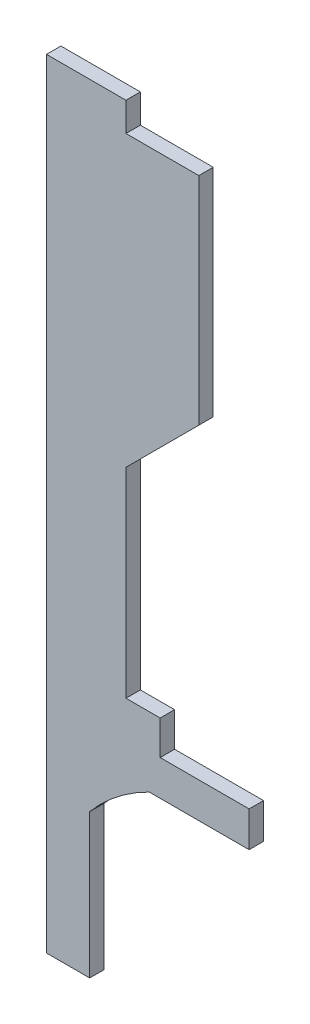
ISO-10303-21;
HEADER;
FILE_DESCRIPTION(('STEP AP214'),'2;1');
FILE_NAME('part.step','',(''),(''),'','','');
FILE_SCHEMA(('AUTOMOTIVE_DESIGN { 1 0 10303 214 1 1 1 1 }'));
ENDSEC;
DATA;
#1=APPLICATION_CONTEXT('core data for automotive mechanical design processes');
#2=APPLICATION_PROTOCOL_DEFINITION('international standard','automotive_design',2000,#1);
#3=PRODUCT_CONTEXT('',#1,'mechanical');
#4=PRODUCT('Part','Part','',(#3));
#5=PRODUCT_RELATED_PRODUCT_CATEGORY('part','',(#4));
#6=PRODUCT_DEFINITION_FORMATION('','',#4);
#7=PRODUCT_DEFINITION_CONTEXT('part definition',#1,'design');
#8=PRODUCT_DEFINITION('design','',#6,#7);
#9=PRODUCT_DEFINITION_SHAPE('','',#8);
#10=(LENGTH_UNIT() NAMED_UNIT(*) SI_UNIT(.MILLI.,.METRE.));
#11=(NAMED_UNIT(*) PLANE_ANGLE_UNIT() SI_UNIT($,.RADIAN.));
#12=(NAMED_UNIT(*) SI_UNIT($,.STERADIAN.) SOLID_ANGLE_UNIT());
#13=UNCERTAINTY_MEASURE_WITH_UNIT(LENGTH_MEASURE(1.E-05),#10,'distance_accuracy_value','');
#14=(GEOMETRIC_REPRESENTATION_CONTEXT(3) GLOBAL_UNCERTAINTY_ASSIGNED_CONTEXT((#13)) GLOBAL_UNIT_ASSIGNED_CONTEXT((#10,
#11,#12)) REPRESENTATION_CONTEXT('',''));
#15=CARTESIAN_POINT('',(0.,0.,0.));
#16=DIRECTION('',(0.,0.,1.));
#17=DIRECTION('',(1.,0.,0.));
#18=AXIS2_PLACEMENT_3D('',#15,#16,#17);
#19=CARTESIAN_POINT('',(27.5725376562433,260.,5.));
#20=DIRECTION('',(0.,-1.,0.));
#21=DIRECTION('',(0.,0.,-1.));
#22=AXIS2_PLACEMENT_3D('',#19,#20,#21);
#23=PLANE('',#22);
#24=DIRECTION('',(-1.,0.,0.));
#25=VECTOR('',#24,1.);
#26=CARTESIAN_POINT('',(27.5725376562433,260.,0.));
#27=LINE('',#26,#25);
#28=CARTESIAN_POINT('',(52.8550366334516,260.,0.));
#29=VERTEX_POINT('',#28);
#30=CARTESIAN_POINT('',(27.5725376562433,260.,0.));
#31=VERTEX_POINT('',#30);
#32=EDGE_CURVE('E171',#29,#31,#27,.T.);
#33=ORIENTED_EDGE('',*,*,#32,.T.);
#34=DIRECTION('',(0.,0.,-1.));
#35=VECTOR('',#34,1.);
#36=CARTESIAN_POINT('',(27.5725376562433,260.,5.));
#37=LINE('',#36,#35);
#38=CARTESIAN_POINT('',(27.5725376562433,260.,5.));
#39=VERTEX_POINT('',#38);
#40=EDGE_CURVE('E11',#39,#31,#37,.T.);
#41=ORIENTED_EDGE('',*,*,#40,.F.);
#42=DIRECTION('',(-1.,0.,0.));
#43=VECTOR('',#42,1.);
#44=CARTESIAN_POINT('',(27.5725376562433,260.,5.));
#45=LINE('',#44,#43);
#46=CARTESIAN_POINT('',(52.8550366334516,260.,5.));
#47=VERTEX_POINT('',#46);
#48=EDGE_CURVE('E199',#47,#39,#45,.T.);
#49=ORIENTED_EDGE('',*,*,#48,.F.);
#50=DIRECTION('',(0.,0.,-1.));
#51=VECTOR('',#50,1.);
#52=CARTESIAN_POINT('',(52.8550366334516,260.,5.));
#53=LINE('',#52,#51);
#54=EDGE_CURVE('E167',#47,#29,#53,.T.);
#55=ORIENTED_EDGE('',*,*,#54,.T.);
#56=EDGE_LOOP('',(#33,#41,#49,#55));
#57=FACE_BOUND('',#56,.T.);
#58=ADVANCED_FACE('F33',(#57),#23,.F.);
#59=CARTESIAN_POINT('',(27.5725376562433,270.,5.));
#60=DIRECTION('',(-1.,0.,0.));
#61=DIRECTION('',(0.,0.,1.));
#62=AXIS2_PLACEMENT_3D('',#59,#60,#61);
#63=PLANE('',#62);
#64=DIRECTION('',(0.,1.,0.));
#65=VECTOR('',#64,1.);
#66=CARTESIAN_POINT('',(27.5725376562433,270.,0.));
#67=LINE('',#66,#65);
#68=CARTESIAN_POINT('',(27.5725376562433,270.,0.));
#69=VERTEX_POINT('',#68);
#70=EDGE_CURVE('E174',#31,#69,#67,.T.);
#71=ORIENTED_EDGE('',*,*,#70,.T.);
#72=DIRECTION('',(0.,0.,-1.));
#73=VECTOR('',#72,1.);
#74=CARTESIAN_POINT('',(27.5725376562433,270.,5.));
#75=LINE('',#74,#73);
#76=CARTESIAN_POINT('',(27.5725376562433,270.,5.));
#77=VERTEX_POINT('',#76);
#78=EDGE_CURVE('E41',#77,#69,#75,.T.);
#79=ORIENTED_EDGE('',*,*,#78,.F.);
#80=DIRECTION('',(0.,1.,0.));
#81=VECTOR('',#80,1.);
#82=CARTESIAN_POINT('',(27.5725376562433,270.,5.));
#83=LINE('',#82,#81);
#84=EDGE_CURVE('E113',#39,#77,#83,.T.);
#85=ORIENTED_EDGE('',*,*,#84,.F.);
#86=ORIENTED_EDGE('',*,*,#40,.T.);
#87=EDGE_LOOP('',(#71,#79,#85,#86));
#88=FACE_BOUND('',#87,.T.);
#89=ADVANCED_FACE('F292',(#88),#63,.F.);
#90=CARTESIAN_POINT('',(0.,270.,5.));
#91=DIRECTION('',(0.,-1.,0.));
#92=DIRECTION('',(0.,0.,-1.));
#93=AXIS2_PLACEMENT_3D('',#90,#91,#92);
#94=PLANE('',#93);
#95=DIRECTION('',(-1.,0.,0.));
#96=VECTOR('',#95,1.);
#97=CARTESIAN_POINT('',(0.,270.,0.));
#98=LINE('',#97,#96);
#99=CARTESIAN_POINT('',(0.,270.,0.));
#100=VERTEX_POINT('',#99);
#101=EDGE_CURVE('E176',#69,#100,#98,.T.);
#102=ORIENTED_EDGE('',*,*,#101,.T.);
#103=DIRECTION('',(0.,0.,-1.));
#104=VECTOR('',#103,1.);
#105=CARTESIAN_POINT('',(0.,270.,5.));
#106=LINE('',#105,#104);
#107=CARTESIAN_POINT('',(0.,270.,5.));
#108=VERTEX_POINT('',#107);
#109=EDGE_CURVE('E227',#108,#100,#106,.T.);
#110=ORIENTED_EDGE('',*,*,#109,.F.);
#111=DIRECTION('',(-1.,0.,0.));
#112=VECTOR('',#111,1.);
#113=CARTESIAN_POINT('',(0.,270.,5.));
#114=LINE('',#113,#112);
#115=EDGE_CURVE('E235',#77,#108,#114,.T.);
#116=ORIENTED_EDGE('',*,*,#115,.F.);
#117=ORIENTED_EDGE('',*,*,#78,.T.);
#118=EDGE_LOOP('',(#102,#110,#116,#117));
#119=FACE_BOUND('',#118,.T.);
#120=ADVANCED_FACE('F233',(#119),#94,.F.);
#121=CARTESIAN_POINT('',(0.,270.,5.));
#122=DIRECTION('',(1.,0.,0.));
#123=DIRECTION('',(0.,1.,0.));
#124=AXIS2_PLACEMENT_3D('',#121,#122,#123);
#125=PLANE('',#124);
#126=DIRECTION('',(0.,-1.,0.));
#127=VECTOR('',#126,1.);
#128=CARTESIAN_POINT('',(0.,270.,0.));
#129=LINE('',#128,#127);
#130=CARTESIAN_POINT('',(0.,0.,0.));
#131=VERTEX_POINT('',#130);
#132=EDGE_CURVE('E178',#100,#131,#129,.T.);
#133=ORIENTED_EDGE('',*,*,#132,.T.);
#134=DIRECTION('',(0.,0.,-1.));
#135=VECTOR('',#134,1.);
#136=CARTESIAN_POINT('',(0.,0.,5.));
#137=LINE('',#136,#135);
#138=CARTESIAN_POINT('',(0.,0.,5.));
#139=VERTEX_POINT('',#138);
#140=EDGE_CURVE('E224',#139,#131,#137,.T.);
#141=ORIENTED_EDGE('',*,*,#140,.F.);
#142=DIRECTION('',(0.,-1.,0.));
#143=VECTOR('',#142,1.);
#144=CARTESIAN_POINT('',(0.,270.,5.));
#145=LINE('',#144,#143);
#146=EDGE_CURVE('E253',#108,#139,#145,.T.);
#147=ORIENTED_EDGE('',*,*,#146,.F.);
#148=ORIENTED_EDGE('',*,*,#109,.T.);
#149=EDGE_LOOP('',(#133,#141,#147,#148));
#150=FACE_BOUND('',#149,.T.);
#151=ADVANCED_FACE('F244',(#150),#125,.F.);
#152=CARTESIAN_POINT('',(15.,0.,5.));
#153=DIRECTION('',(0.,1.,0.));
#154=DIRECTION('',(-1.,0.,0.));
#155=AXIS2_PLACEMENT_3D('',#152,#153,#154);
#156=PLANE('',#155);
#157=DIRECTION('',(1.,0.,0.));
#158=VECTOR('',#157,1.);
#159=CARTESIAN_POINT('',(15.,0.,0.));
#160=LINE('',#159,#158);
#161=CARTESIAN_POINT('',(15.,0.,0.));
#162=VERTEX_POINT('',#161);
#163=EDGE_CURVE('E180',#131,#162,#160,.T.);
#164=ORIENTED_EDGE('',*,*,#163,.T.);
#165=DIRECTION('',(0.,0.,-1.));
#166=VECTOR('',#165,1.);
#167=CARTESIAN_POINT('',(15.,0.,5.));
#168=LINE('',#167,#166);
#169=CARTESIAN_POINT('',(15.,0.,5.));
#170=VERTEX_POINT('',#169);
#171=EDGE_CURVE('E221',#170,#162,#168,.T.);
#172=ORIENTED_EDGE('',*,*,#171,.F.);
#173=DIRECTION('',(1.,0.,0.));
#174=VECTOR('',#173,1.);
#175=CARTESIAN_POINT('',(15.,0.,5.));
#176=LINE('',#175,#174);
#177=EDGE_CURVE('E250',#139,#170,#176,.T.);
#178=ORIENTED_EDGE('',*,*,#177,.F.);
#179=ORIENTED_EDGE('',*,*,#140,.T.);
#180=EDGE_LOOP('',(#164,#172,#178,#179));
#181=FACE_BOUND('',#180,.T.);
#182=ADVANCED_FACE('F248',(#181),#156,.F.);
#183=CARTESIAN_POINT('',(15.,50.,5.));
#184=DIRECTION('',(-1.,0.,0.));
#185=DIRECTION('',(0.,-1.,0.));
#186=AXIS2_PLACEMENT_3D('',#183,#184,#185);
#187=PLANE('',#186);
#188=DIRECTION('',(0.,1.,0.));
#189=VECTOR('',#188,1.);
#190=CARTESIAN_POINT('',(15.,50.,0.));
#191=LINE('',#190,#189);
#192=CARTESIAN_POINT('',(15.,50.,0.));
#193=VERTEX_POINT('',#192);
#194=EDGE_CURVE('E182',#162,#193,#191,.T.);
#195=ORIENTED_EDGE('',*,*,#194,.T.);
#196=DIRECTION('',(0.,0.,-1.));
#197=VECTOR('',#196,1.);
#198=CARTESIAN_POINT('',(15.,50.,5.));
#199=LINE('',#198,#197);
#200=CARTESIAN_POINT('',(15.,50.,5.));
#201=VERTEX_POINT('',#200);
#202=EDGE_CURVE('E218',#201,#193,#199,.T.);
#203=ORIENTED_EDGE('',*,*,#202,.F.);
#204=DIRECTION('',(0.,1.,0.));
#205=VECTOR('',#204,1.);
#206=CARTESIAN_POINT('',(15.,50.,5.));
#207=LINE('',#206,#205);
#208=EDGE_CURVE('E252',#170,#201,#207,.T.);
#209=ORIENTED_EDGE('',*,*,#208,.F.);
#210=ORIENTED_EDGE('',*,*,#171,.T.);
#211=EDGE_LOOP('',(#195,#203,#209,#210));
#212=FACE_BOUND('',#211,.T.);
#213=ADVANCED_FACE('F305',(#212),#187,.F.);
#214=CARTESIAN_POINT('',(63.6029621909328,9.22507218004147,5.));
#215=DIRECTION('',(0.,0.,-1.));
#216=DIRECTION('',(-1.,0.,0.));
#217=AXIS2_PLACEMENT_3D('',#214,#215,#216);
#218=CYLINDRICAL_SURFACE('',#217,63.4416477753855);
#219=CARTESIAN_POINT('',(63.6029621909328,9.22507218004147,0.));
#220=DIRECTION('',(0.,0.,-1.));
#221=DIRECTION('',(-1.,0.,0.));
#222=AXIS2_PLACEMENT_3D('',#219,#220,#221);
#223=CIRCLE('',#222,63.4416477753855);
#224=CARTESIAN_POINT('',(35.6700046880016,66.1863972839706,0.));
#225=VERTEX_POINT('',#224);
#226=EDGE_CURVE('E184',#193,#225,#223,.T.);
#227=ORIENTED_EDGE('',*,*,#226,.T.);
#228=DIRECTION('',(0.,0.,-1.));
#229=VECTOR('',#228,1.);
#230=CARTESIAN_POINT('',(35.6700046880016,66.1863972839706,5.));
#231=LINE('',#230,#229);
#232=CARTESIAN_POINT('',(35.6700046880016,66.1863972839706,5.));
#233=VERTEX_POINT('',#232);
#234=EDGE_CURVE('E215',#233,#225,#231,.T.);
#235=ORIENTED_EDGE('',*,*,#234,.F.);
#236=CARTESIAN_POINT('',(63.6029621909328,9.22507218004147,5.));
#237=DIRECTION('',(0.,0.,-1.));
#238=DIRECTION('',(-1.,0.,0.));
#239=AXIS2_PLACEMENT_3D('',#236,#237,#238);
#240=CIRCLE('',#239,63.4416477753855);
#241=EDGE_CURVE('E255',#201,#233,#240,.T.);
#242=ORIENTED_EDGE('',*,*,#241,.F.);
#243=ORIENTED_EDGE('',*,*,#202,.T.);
#244=EDGE_LOOP('',(#227,#235,#242,#243));
#245=FACE_BOUND('',#244,.T.);
#246=ADVANCED_FACE('F308',(#245),#218,.F.);
#247=CARTESIAN_POINT('',(35.6700046880016,66.1863972839706,5.));
#248=DIRECTION('',(0.,1.,0.));
#249=DIRECTION('',(0.,0.,1.));
#250=AXIS2_PLACEMENT_3D('',#247,#248,#249);
#251=PLANE('',#250);
#252=DIRECTION('',(1.,0.,0.));
#253=VECTOR('',#252,1.);
#254=CARTESIAN_POINT('',(35.6700046880016,66.1863972839706,0.));
#255=LINE('',#254,#253);
#256=CARTESIAN_POINT('',(70.2971928091577,66.1863972839706,0.));
#257=VERTEX_POINT('',#256);
#258=EDGE_CURVE('E186',#225,#257,#255,.T.);
#259=ORIENTED_EDGE('',*,*,#258,.T.);
#260=DIRECTION('',(0.,0.,-1.));
#261=VECTOR('',#260,1.);
#262=CARTESIAN_POINT('',(70.2971928091577,66.1863972839706,5.));
#263=LINE('',#262,#261);
#264=CARTESIAN_POINT('',(70.2971928091577,66.1863972839706,5.));
#265=VERTEX_POINT('',#264);
#266=EDGE_CURVE('E212',#265,#257,#263,.T.);
#267=ORIENTED_EDGE('',*,*,#266,.F.);
#268=DIRECTION('',(1.,0.,0.));
#269=VECTOR('',#268,1.);
#270=CARTESIAN_POINT('',(35.6700046880016,66.1863972839706,5.));
#271=LINE('',#270,#269);
#272=EDGE_CURVE('E261',#233,#265,#271,.T.);
#273=ORIENTED_EDGE('',*,*,#272,.F.);
#274=ORIENTED_EDGE('',*,*,#234,.T.);
#275=EDGE_LOOP('',(#259,#267,#273,#274));
#276=FACE_BOUND('',#275,.T.);
#277=ADVANCED_FACE('F312',(#276),#251,.F.);
#278=CARTESIAN_POINT('',(70.2971928091577,66.1863972839706,5.));
#279=DIRECTION('',(-1.,0.,0.));
#280=DIRECTION('',(0.,0.,1.));
#281=AXIS2_PLACEMENT_3D('',#278,#279,#280);
#282=PLANE('',#281);
#283=DIRECTION('',(0.,1.,0.));
#284=VECTOR('',#283,1.);
#285=CARTESIAN_POINT('',(70.2971928091577,66.1863972839706,0.));
#286=LINE('',#285,#284);
#287=CARTESIAN_POINT('',(70.2971928091577,78.451204867964,0.));
#288=VERTEX_POINT('',#287);
#289=EDGE_CURVE('E188',#257,#288,#286,.T.);
#290=ORIENTED_EDGE('',*,*,#289,.T.);
#291=DIRECTION('',(0.,0.,-1.));
#292=VECTOR('',#291,1.);
#293=CARTESIAN_POINT('',(70.2971928091577,78.451204867964,5.));
#294=LINE('',#293,#292);
#295=CARTESIAN_POINT('',(70.2971928091577,78.451204867964,5.));
#296=VERTEX_POINT('',#295);
#297=EDGE_CURVE('E209',#296,#288,#294,.T.);
#298=ORIENTED_EDGE('',*,*,#297,.F.);
#299=DIRECTION('',(0.,1.,0.));
#300=VECTOR('',#299,1.);
#301=CARTESIAN_POINT('',(70.2971928091577,66.1863972839706,5.));
#302=LINE('',#301,#300);
#303=EDGE_CURVE('E263',#265,#296,#302,.T.);
#304=ORIENTED_EDGE('',*,*,#303,.F.);
#305=ORIENTED_EDGE('',*,*,#266,.T.);
#306=EDGE_LOOP('',(#290,#298,#304,#305));
#307=FACE_BOUND('',#306,.T.);
#308=ADVANCED_FACE('F316',(#307),#282,.F.);
#309=CARTESIAN_POINT('',(70.2971928091577,78.451204867964,5.));
#310=DIRECTION('',(0.,-1.,0.));
#311=DIRECTION('',(1.,0.,0.));
#312=AXIS2_PLACEMENT_3D('',#309,#310,#311);
#313=PLANE('',#312);
#314=DIRECTION('',(-1.,0.,0.));
#315=VECTOR('',#314,1.);
#316=CARTESIAN_POINT('',(70.2971928091577,78.451204867964,0.));
#317=LINE('',#316,#315);
#318=CARTESIAN_POINT('',(39.4392934446045,78.4512048679638,0.));
#319=VERTEX_POINT('',#318);
#320=EDGE_CURVE('E190',#288,#319,#317,.T.);
#321=ORIENTED_EDGE('',*,*,#320,.T.);
#322=DIRECTION('',(0.,0.,-1.));
#323=VECTOR('',#322,1.);
#324=CARTESIAN_POINT('',(39.4392934446045,78.4512048679638,5.));
#325=LINE('',#324,#323);
#326=CARTESIAN_POINT('',(39.4392934446045,78.4512048679638,5.));
#327=VERTEX_POINT('',#326);
#328=EDGE_CURVE('E206',#327,#319,#325,.T.);
#329=ORIENTED_EDGE('',*,*,#328,.F.);
#330=DIRECTION('',(-1.,0.,0.));
#331=VECTOR('',#330,1.);
#332=CARTESIAN_POINT('',(70.2971928091577,78.451204867964,5.));
#333=LINE('',#332,#331);
#334=EDGE_CURVE('E265',#296,#327,#333,.T.);
#335=ORIENTED_EDGE('',*,*,#334,.F.);
#336=ORIENTED_EDGE('',*,*,#297,.T.);
#337=EDGE_LOOP('',(#321,#329,#335,#336));
#338=FACE_BOUND('',#337,.T.);
#339=ADVANCED_FACE('F320',(#338),#313,.F.);
#340=CARTESIAN_POINT('',(39.4392934446045,90.3339871815086,5.));
#341=DIRECTION('',(-1.,0.,0.));
#342=DIRECTION('',(0.,0.,1.));
#343=AXIS2_PLACEMENT_3D('',#340,#341,#342);
#344=PLANE('',#343);
#345=DIRECTION('',(0.,1.,0.));
#346=VECTOR('',#345,1.);
#347=CARTESIAN_POINT('',(39.4392934446045,90.3339871815086,0.));
#348=LINE('',#347,#346);
#349=CARTESIAN_POINT('',(39.4392934446045,90.3339871815086,0.));
#350=VERTEX_POINT('',#349);
#351=EDGE_CURVE('E192',#319,#350,#348,.T.);
#352=ORIENTED_EDGE('',*,*,#351,.T.);
#353=DIRECTION('',(0.,0.,-1.));
#354=VECTOR('',#353,1.);
#355=CARTESIAN_POINT('',(39.4392934446045,90.3339871815086,5.));
#356=LINE('',#355,#354);
#357=CARTESIAN_POINT('',(39.4392934446045,90.3339871815086,5.));
#358=VERTEX_POINT('',#357);
#359=EDGE_CURVE('E203',#358,#350,#356,.T.);
#360=ORIENTED_EDGE('',*,*,#359,.F.);
#361=DIRECTION('',(0.,1.,0.));
#362=VECTOR('',#361,1.);
#363=CARTESIAN_POINT('',(39.4392934446045,90.3339871815086,5.));
#364=LINE('',#363,#362);
#365=EDGE_CURVE('E267',#327,#358,#364,.T.);
#366=ORIENTED_EDGE('',*,*,#365,.F.);
#367=ORIENTED_EDGE('',*,*,#328,.T.);
#368=EDGE_LOOP('',(#352,#360,#366,#367));
#369=FACE_BOUND('',#368,.T.);
#370=ADVANCED_FACE('F273',(#369),#344,.F.);
#371=CARTESIAN_POINT('',(27.5725376562433,90.3339871815086,5.));
#372=DIRECTION('',(0.,-1.,0.));
#373=DIRECTION('',(0.,0.,-1.));
#374=AXIS2_PLACEMENT_3D('',#371,#372,#373);
#375=PLANE('',#374);
#376=DIRECTION('',(-1.,0.,0.));
#377=VECTOR('',#376,1.);
#378=CARTESIAN_POINT('',(27.5725376562433,90.3339871815086,0.));
#379=LINE('',#378,#377);
#380=CARTESIAN_POINT('',(27.5725376562433,90.3339871815086,0.));
#381=VERTEX_POINT('',#380);
#382=EDGE_CURVE('E194',#350,#381,#379,.T.);
#383=ORIENTED_EDGE('',*,*,#382,.T.);
#384=DIRECTION('',(0.,0.,-1.));
#385=VECTOR('',#384,1.);
#386=CARTESIAN_POINT('',(27.5725376562433,90.3339871815086,5.));
#387=LINE('',#386,#385);
#388=CARTESIAN_POINT('',(27.5725376562433,90.3339871815086,5.));
#389=VERTEX_POINT('',#388);
#390=EDGE_CURVE('E162',#389,#381,#387,.T.);
#391=ORIENTED_EDGE('',*,*,#390,.F.);
#392=DIRECTION('',(-1.,0.,0.));
#393=VECTOR('',#392,1.);
#394=CARTESIAN_POINT('',(27.5725376562433,90.3339871815086,5.));
#395=LINE('',#394,#393);
#396=EDGE_CURVE('E153',#358,#389,#395,.T.);
#397=ORIENTED_EDGE('',*,*,#396,.F.);
#398=ORIENTED_EDGE('',*,*,#359,.T.);
#399=EDGE_LOOP('',(#383,#391,#397,#398));
#400=FACE_BOUND('',#399,.T.);
#401=ADVANCED_FACE('F277',(#400),#375,.F.);
#402=CARTESIAN_POINT('',(27.5725376562433,159.717501022792,5.));
#403=DIRECTION('',(-1.,0.,0.));
#404=DIRECTION('',(0.,-1.,0.));
#405=AXIS2_PLACEMENT_3D('',#402,#403,#404);
#406=PLANE('',#405);
#407=DIRECTION('',(0.,1.,0.));
#408=VECTOR('',#407,1.);
#409=CARTESIAN_POINT('',(27.5725376562433,159.717501022792,0.));
#410=LINE('',#409,#408);
#411=CARTESIAN_POINT('',(27.5725376562433,159.717501022792,0.));
#412=VERTEX_POINT('',#411);
#413=EDGE_CURVE('E161',#381,#412,#410,.T.);
#414=ORIENTED_EDGE('',*,*,#413,.T.);
#415=DIRECTION('',(0.,0.,-1.));
#416=VECTOR('',#415,1.);
#417=CARTESIAN_POINT('',(27.5725376562433,159.717501022792,5.));
#418=LINE('',#417,#416);
#419=CARTESIAN_POINT('',(27.5725376562433,159.717501022792,5.));
#420=VERTEX_POINT('',#419);
#421=EDGE_CURVE('E158',#420,#412,#418,.T.);
#422=ORIENTED_EDGE('',*,*,#421,.F.);
#423=DIRECTION('',(0.,1.,0.));
#424=VECTOR('',#423,1.);
#425=CARTESIAN_POINT('',(27.5725376562433,159.717501022792,5.));
#426=LINE('',#425,#424);
#427=EDGE_CURVE('E147',#389,#420,#426,.T.);
#428=ORIENTED_EDGE('',*,*,#427,.F.);
#429=ORIENTED_EDGE('',*,*,#390,.T.);
#430=EDGE_LOOP('',(#414,#422,#428,#429));
#431=FACE_BOUND('',#430,.T.);
#432=ADVANCED_FACE('F159',(#431),#406,.F.);
#433=CARTESIAN_POINT('',(27.5725376562433,159.717501022792,5.));
#434=DIRECTION('',(-0.707106781186546,0.707106781186549,0.));
#435=DIRECTION('',(-0.707106781186549,-0.707106781186546,0.));
#436=AXIS2_PLACEMENT_3D('',#433,#434,#435);
#437=PLANE('',#436);
#438=DIRECTION('',(0.707106781186549,0.707106781186546,0.));
#439=VECTOR('',#438,1.);
#440=CARTESIAN_POINT('',(27.5725376562433,159.717501022792,0.));
#441=LINE('',#440,#439);
#442=CARTESIAN_POINT('',(52.8550366334516,185.,0.));
#443=VERTEX_POINT('',#442);
#444=EDGE_CURVE('E99',#412,#443,#441,.T.);
#445=ORIENTED_EDGE('',*,*,#444,.T.);
#446=DIRECTION('',(0.,0.,-1.));
#447=VECTOR('',#446,1.);
#448=CARTESIAN_POINT('',(52.8550366334516,185.,5.));
#449=LINE('',#448,#447);
#450=CARTESIAN_POINT('',(52.8550366334516,185.,5.));
#451=VERTEX_POINT('',#450);
#452=EDGE_CURVE('E163',#451,#443,#449,.T.);
#453=ORIENTED_EDGE('',*,*,#452,.F.);
#454=DIRECTION('',(0.707106781186549,0.707106781186546,0.));
#455=VECTOR('',#454,1.);
#456=CARTESIAN_POINT('',(27.5725376562433,159.717501022792,5.));
#457=LINE('',#456,#455);
#458=EDGE_CURVE('E151',#420,#451,#457,.T.);
#459=ORIENTED_EDGE('',*,*,#458,.F.);
#460=ORIENTED_EDGE('',*,*,#421,.T.);
#461=EDGE_LOOP('',(#445,#453,#459,#460));
#462=FACE_BOUND('',#461,.T.);
#463=ADVANCED_FACE('F165',(#462),#437,.F.);
#464=CARTESIAN_POINT('',(52.8550366334516,185.,5.));
#465=DIRECTION('',(-1.,0.,0.));
#466=DIRECTION('',(0.,0.,1.));
#467=AXIS2_PLACEMENT_3D('',#464,#465,#466);
#468=PLANE('',#467);
#469=DIRECTION('',(0.,1.,0.));
#470=VECTOR('',#469,1.);
#471=CARTESIAN_POINT('',(52.8550366334516,185.,0.));
#472=LINE('',#471,#470);
#473=EDGE_CURVE('E105',#443,#29,#472,.T.);
#474=ORIENTED_EDGE('',*,*,#473,.T.);
#475=ORIENTED_EDGE('',*,*,#54,.F.);
#476=DIRECTION('',(0.,1.,0.));
#477=VECTOR('',#476,1.);
#478=CARTESIAN_POINT('',(52.8550366334516,185.,5.));
#479=LINE('',#478,#477);
#480=EDGE_CURVE('E49',#451,#47,#479,.T.);
#481=ORIENTED_EDGE('',*,*,#480,.F.);
#482=ORIENTED_EDGE('',*,*,#452,.T.);
#483=EDGE_LOOP('',(#474,#475,#481,#482));
#484=FACE_BOUND('',#483,.T.);
#485=ADVANCED_FACE('F281',(#484),#468,.F.);
#486=CARTESIAN_POINT('',(63.6029621909328,9.22507218004147,5.));
#487=DIRECTION('',(0.,0.,-1.));
#488=DIRECTION('',(-1.,0.,0.));
#489=AXIS2_PLACEMENT_3D('',#486,#487,#488);
#490=PLANE('',#489);
#491=ORIENTED_EDGE('',*,*,#48,.T.);
#492=ORIENTED_EDGE('',*,*,#84,.T.);
#493=ORIENTED_EDGE('',*,*,#115,.T.);
#494=ORIENTED_EDGE('',*,*,#146,.T.);
#495=ORIENTED_EDGE('',*,*,#177,.T.);
#496=ORIENTED_EDGE('',*,*,#208,.T.);
#497=ORIENTED_EDGE('',*,*,#241,.T.);
#498=ORIENTED_EDGE('',*,*,#272,.T.);
#499=ORIENTED_EDGE('',*,*,#303,.T.);
#500=ORIENTED_EDGE('',*,*,#334,.T.);
#501=ORIENTED_EDGE('',*,*,#365,.T.);
#502=ORIENTED_EDGE('',*,*,#396,.T.);
#503=ORIENTED_EDGE('',*,*,#427,.T.);
#504=ORIENTED_EDGE('',*,*,#458,.T.);
#505=ORIENTED_EDGE('',*,*,#480,.T.);
#506=EDGE_LOOP('',(#491,#492,#493,#494,#495,#496,#497,#498,#499,#500,#501,#502,#503,#504,#505));
#507=FACE_BOUND('',#506,.T.);
#508=ADVANCED_FACE('F149',(#507),#490,.F.);
#509=CARTESIAN_POINT('',(63.6029621909328,9.22507218004147,0.));
#510=DIRECTION('',(0.,0.,-1.));
#511=DIRECTION('',(-1.,0.,0.));
#512=AXIS2_PLACEMENT_3D('',#509,#510,#511);
#513=PLANE('',#512);
#514=ORIENTED_EDGE('',*,*,#32,.F.);
#515=ORIENTED_EDGE('',*,*,#473,.F.);
#516=ORIENTED_EDGE('',*,*,#444,.F.);
#517=ORIENTED_EDGE('',*,*,#413,.F.);
#518=ORIENTED_EDGE('',*,*,#382,.F.);
#519=ORIENTED_EDGE('',*,*,#351,.F.);
#520=ORIENTED_EDGE('',*,*,#320,.F.);
#521=ORIENTED_EDGE('',*,*,#289,.F.);
#522=ORIENTED_EDGE('',*,*,#258,.F.);
#523=ORIENTED_EDGE('',*,*,#226,.F.);
#524=ORIENTED_EDGE('',*,*,#194,.F.);
#525=ORIENTED_EDGE('',*,*,#163,.F.);
#526=ORIENTED_EDGE('',*,*,#132,.F.);
#527=ORIENTED_EDGE('',*,*,#101,.F.);
#528=ORIENTED_EDGE('',*,*,#70,.F.);
#529=EDGE_LOOP('',(#514,#515,#516,#517,#518,#519,#520,#521,#522,#523,#524,#525,#526,#527,#528));
#530=FACE_BOUND('',#529,.T.);
#531=ADVANCED_FACE('F239',(#530),#513,.T.);
#532=CLOSED_SHELL('',(#58,#89,#120,#151,#182,#213,#246,#277,#308,#339,#370,#401,#432,#463,#485,
#508,#531));
#533=MANIFOLD_SOLID_BREP('B2',#532);
#534=ADVANCED_BREP_SHAPE_REPRESENTATION('',(#18,#533),#14);
#535=SHAPE_DEFINITION_REPRESENTATION(#9,#534);
ENDSEC;
END-ISO-10303-21;
